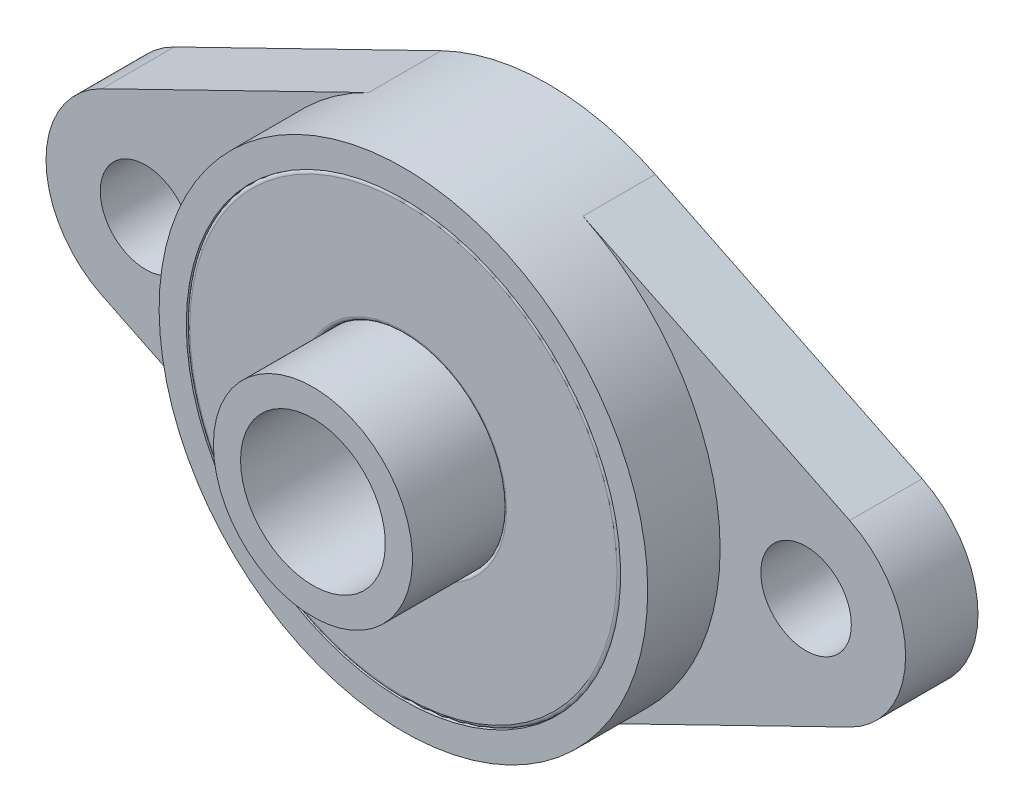
ISO-10303-21;
HEADER;
FILE_DESCRIPTION(('STEP AP214'),'2;1');
FILE_NAME('part.step','',(''),(''),'','','');
FILE_SCHEMA(('AUTOMOTIVE_DESIGN { 1 0 10303 214 1 1 1 1 }'));
ENDSEC;
DATA;
#1=APPLICATION_CONTEXT('core data for automotive mechanical design processes');
#2=APPLICATION_PROTOCOL_DEFINITION('international standard','automotive_design',2000,#1);
#3=PRODUCT_CONTEXT('',#1,'mechanical');
#4=PRODUCT('Part','Part','',(#3));
#5=PRODUCT_RELATED_PRODUCT_CATEGORY('part','',(#4));
#6=PRODUCT_DEFINITION_FORMATION('','',#4);
#7=PRODUCT_DEFINITION_CONTEXT('part definition',#1,'design');
#8=PRODUCT_DEFINITION('design','',#6,#7);
#9=PRODUCT_DEFINITION_SHAPE('','',#8);
#10=(LENGTH_UNIT() NAMED_UNIT(*) SI_UNIT(.MILLI.,.METRE.));
#11=(NAMED_UNIT(*) PLANE_ANGLE_UNIT() SI_UNIT($,.RADIAN.));
#12=(NAMED_UNIT(*) SI_UNIT($,.STERADIAN.) SOLID_ANGLE_UNIT());
#13=UNCERTAINTY_MEASURE_WITH_UNIT(LENGTH_MEASURE(1.E-05),#10,'distance_accuracy_value','');
#14=(GEOMETRIC_REPRESENTATION_CONTEXT(3) GLOBAL_UNCERTAINTY_ASSIGNED_CONTEXT((#13)) GLOBAL_UNIT_ASSIGNED_CONTEXT((#10,
#11,#12)) REPRESENTATION_CONTEXT('',''));
#15=CARTESIAN_POINT('',(0.,0.,0.));
#16=DIRECTION('',(0.,0.,1.));
#17=DIRECTION('',(1.,0.,0.));
#18=AXIS2_PLACEMENT_3D('',#15,#16,#17);
#19=CARTESIAN_POINT('',(0.,0.,8.));
#20=DIRECTION('',(0.,0.,-1.));
#21=DIRECTION('',(-1.,0.,0.));
#22=AXIS2_PLACEMENT_3D('',#19,#20,#21);
#23=CYLINDRICAL_SURFACE('',#22,5.5);
#24=CARTESIAN_POINT('',(0.,0.,0.2));
#25=DIRECTION('',(0.,0.,1.));
#26=DIRECTION('',(1.,0.,0.));
#27=AXIS2_PLACEMENT_3D('',#24,#25,#26);
#28=CIRCLE('',#27,5.5);
#29=CARTESIAN_POINT('',(5.5,0.,0.2));
#30=VERTEX_POINT('',#29);
#31=EDGE_CURVE('E63',#30,#30,#28,.F.);
#32=ORIENTED_EDGE('',*,*,#31,.T.);
#33=EDGE_LOOP('',(#32));
#34=FACE_BOUND('',#33,.T.);
#35=CARTESIAN_POINT('',(0.,0.,7.8));
#36=DIRECTION('',(0.,0.,1.));
#37=DIRECTION('',(1.,0.,0.));
#38=AXIS2_PLACEMENT_3D('',#35,#36,#37);
#39=CIRCLE('',#38,5.5);
#40=CARTESIAN_POINT('',(5.5,0.,7.8));
#41=VERTEX_POINT('',#40);
#42=EDGE_CURVE('E67',#41,#41,#39,.T.);
#43=ORIENTED_EDGE('',*,*,#42,.T.);
#44=EDGE_LOOP('',(#43));
#45=FACE_BOUND('',#44,.T.);
#46=ADVANCED_FACE('F52',(#34,#45),#23,.F.);
#47=CARTESIAN_POINT('',(0.,0.,8.));
#48=DIRECTION('',(0.,0.,-1.));
#49=DIRECTION('',(-1.,0.,0.));
#50=AXIS2_PLACEMENT_3D('',#47,#48,#49);
#51=CYLINDRICAL_SURFACE('',#50,12.);
#52=CARTESIAN_POINT('',(0.,0.,0.2));
#53=DIRECTION('',(0.,0.,1.));
#54=DIRECTION('',(1.,0.,0.));
#55=AXIS2_PLACEMENT_3D('',#52,#53,#54);
#56=CIRCLE('',#55,12.);
#57=CARTESIAN_POINT('',(12.,0.,0.2));
#58=VERTEX_POINT('',#57);
#59=EDGE_CURVE('E78',#58,#58,#56,.T.);
#60=ORIENTED_EDGE('',*,*,#59,.T.);
#61=EDGE_LOOP('',(#60));
#62=FACE_BOUND('',#61,.T.);
#63=CARTESIAN_POINT('',(0.,0.,7.8));
#64=DIRECTION('',(0.,0.,1.));
#65=DIRECTION('',(1.,0.,0.));
#66=AXIS2_PLACEMENT_3D('',#63,#64,#65);
#67=CIRCLE('',#66,12.);
#68=CARTESIAN_POINT('',(12.,0.,7.8));
#69=VERTEX_POINT('',#68);
#70=EDGE_CURVE('E81',#69,#69,#67,.F.);
#71=ORIENTED_EDGE('',*,*,#70,.T.);
#72=EDGE_LOOP('',(#71));
#73=FACE_BOUND('',#72,.T.);
#74=ADVANCED_FACE('F85',(#62,#73),#51,.T.);
#75=CARTESIAN_POINT('',(0.,0.,8.));
#76=DIRECTION('',(0.,0.,1.));
#77=DIRECTION('',(1.,0.,0.));
#78=AXIS2_PLACEMENT_3D('',#75,#76,#77);
#79=PLANE('',#78);
#80=CARTESIAN_POINT('',(0.,0.,8.));
#81=DIRECTION('',(0.,0.,1.));
#82=DIRECTION('',(1.,0.,0.));
#83=AXIS2_PLACEMENT_3D('',#80,#81,#82);
#84=CIRCLE('',#83,5.7);
#85=CARTESIAN_POINT('',(5.7,0.,8.));
#86=VERTEX_POINT('',#85);
#87=EDGE_CURVE('E12',#86,#86,#84,.F.);
#88=ORIENTED_EDGE('',*,*,#87,.T.);
#89=EDGE_LOOP('',(#88));
#90=FACE_BOUND('',#89,.T.);
#91=CARTESIAN_POINT('',(0.,0.,8.));
#92=DIRECTION('',(0.,0.,1.));
#93=DIRECTION('',(1.,0.,0.));
#94=AXIS2_PLACEMENT_3D('',#91,#92,#93);
#95=CIRCLE('',#94,11.8);
#96=CARTESIAN_POINT('',(11.8,0.,8.));
#97=VERTEX_POINT('',#96);
#98=EDGE_CURVE('E59',#97,#97,#95,.T.);
#99=ORIENTED_EDGE('',*,*,#98,.T.);
#100=EDGE_LOOP('',(#99));
#101=FACE_BOUND('',#100,.T.);
#102=ADVANCED_FACE('F101',(#90,#101),#79,.T.);
#103=CARTESIAN_POINT('',(0.,0.,0.));
#104=DIRECTION('',(0.,0.,1.));
#105=DIRECTION('',(1.,0.,0.));
#106=AXIS2_PLACEMENT_3D('',#103,#104,#105);
#107=PLANE('',#106);
#108=CARTESIAN_POINT('',(0.,0.,0.));
#109=DIRECTION('',(0.,0.,1.));
#110=DIRECTION('',(1.,0.,0.));
#111=AXIS2_PLACEMENT_3D('',#108,#109,#110);
#112=CIRCLE('',#111,11.8);
#113=CARTESIAN_POINT('',(11.8,0.,0.));
#114=VERTEX_POINT('',#113);
#115=EDGE_CURVE('E72',#114,#114,#112,.F.);
#116=ORIENTED_EDGE('',*,*,#115,.T.);
#117=EDGE_LOOP('',(#116));
#118=FACE_BOUND('',#117,.T.);
#119=CARTESIAN_POINT('',(0.,0.,0.));
#120=DIRECTION('',(0.,0.,1.));
#121=DIRECTION('',(1.,0.,0.));
#122=AXIS2_PLACEMENT_3D('',#119,#120,#121);
#123=CIRCLE('',#122,5.7);
#124=CARTESIAN_POINT('',(5.7,0.,0.));
#125=VERTEX_POINT('',#124);
#126=EDGE_CURVE('E75',#125,#125,#123,.T.);
#127=ORIENTED_EDGE('',*,*,#126,.T.);
#128=EDGE_LOOP('',(#127));
#129=FACE_BOUND('',#128,.T.);
#130=ADVANCED_FACE('F110',(#118,#129),#107,.F.);
#131=CARTESIAN_POINT('',(0.,0.,0.2));
#132=DIRECTION('',(0.,0.,1.));
#133=DIRECTION('',(1.,0.,0.));
#134=AXIS2_PLACEMENT_3D('',#131,#132,#133);
#135=TOROIDAL_SURFACE('',#134,11.8,0.2);
#136=ORIENTED_EDGE('',*,*,#115,.F.);
#137=EDGE_LOOP('',(#136));
#138=FACE_BOUND('',#137,.T.);
#139=ORIENTED_EDGE('',*,*,#59,.F.);
#140=EDGE_LOOP('',(#139));
#141=FACE_BOUND('',#140,.T.);
#142=ADVANCED_FACE('F107',(#138,#141),#135,.T.);
#143=CARTESIAN_POINT('',(0.,0.,0.2));
#144=DIRECTION('',(0.,0.,1.));
#145=DIRECTION('',(1.,0.,0.));
#146=AXIS2_PLACEMENT_3D('',#143,#144,#145);
#147=TOROIDAL_SURFACE('',#146,5.7,0.2);
#148=ORIENTED_EDGE('',*,*,#31,.F.);
#149=EDGE_LOOP('',(#148));
#150=FACE_BOUND('',#149,.T.);
#151=ORIENTED_EDGE('',*,*,#126,.F.);
#152=EDGE_LOOP('',(#151));
#153=FACE_BOUND('',#152,.T.);
#154=ADVANCED_FACE('F93',(#150,#153),#147,.T.);
#155=CARTESIAN_POINT('',(0.,0.,7.8));
#156=DIRECTION('',(0.,0.,1.));
#157=DIRECTION('',(1.,0.,0.));
#158=AXIS2_PLACEMENT_3D('',#155,#156,#157);
#159=TOROIDAL_SURFACE('',#158,5.7,0.2);
#160=ORIENTED_EDGE('',*,*,#87,.F.);
#161=EDGE_LOOP('',(#160));
#162=FACE_BOUND('',#161,.T.);
#163=ORIENTED_EDGE('',*,*,#42,.F.);
#164=EDGE_LOOP('',(#163));
#165=FACE_BOUND('',#164,.T.);
#166=ADVANCED_FACE('F89',(#162,#165),#159,.T.);
#167=CARTESIAN_POINT('',(0.,0.,7.8));
#168=DIRECTION('',(0.,0.,1.));
#169=DIRECTION('',(1.,0.,0.));
#170=AXIS2_PLACEMENT_3D('',#167,#168,#169);
#171=TOROIDAL_SURFACE('',#170,11.8,0.2);
#172=ORIENTED_EDGE('',*,*,#70,.F.);
#173=EDGE_LOOP('',(#172));
#174=FACE_BOUND('',#173,.T.);
#175=ORIENTED_EDGE('',*,*,#98,.F.);
#176=EDGE_LOOP('',(#175));
#177=FACE_BOUND('',#176,.T.);
#178=ADVANCED_FACE('F54',(#174,#177),#171,.T.);
#179=CLOSED_SHELL('',(#46,#74,#102,#130,#142,#154,#166,#178));
#180=MANIFOLD_SOLID_BREP('B2',#179);
#181=CARTESIAN_POINT('',(0.,0.,13.));
#182=DIRECTION('',(0.,0.,-1.));
#183=DIRECTION('',(-1.,0.,0.));
#184=AXIS2_PLACEMENT_3D('',#181,#182,#183);
#185=CYLINDRICAL_SURFACE('',#184,4.);
#186=CARTESIAN_POINT('',(0.,0.,13.));
#187=DIRECTION('',(0.,0.,1.));
#188=DIRECTION('',(1.,0.,0.));
#189=AXIS2_PLACEMENT_3D('',#186,#187,#188);
#190=CIRCLE('',#189,4.);
#191=CARTESIAN_POINT('',(-4.,0.,13.));
#192=VERTEX_POINT('',#191);
#193=EDGE_CURVE('E191',#192,#192,#190,.T.);
#194=CARTESIAN_POINT('',(0.,0.,0.));
#195=DIRECTION('',(0.,0.,1.));
#196=DIRECTION('',(1.,0.,0.));
#197=AXIS2_PLACEMENT_3D('',#194,#195,#196);
#198=CIRCLE('',#197,4.);
#199=CARTESIAN_POINT('',(-4.,0.,0.));
#200=VERTEX_POINT('',#199);
#201=EDGE_CURVE('E197',#200,#200,#198,.T.);
#202=CARTESIAN_POINT('',(-4.,0.,13.));
#203=CARTESIAN_POINT('',(-4.,0.,12.8645833333333));
#204=CARTESIAN_POINT('',(-4.,0.,12.7291666666667));
#205=CARTESIAN_POINT('',(-4.,0.,12.4583333333333));
#206=CARTESIAN_POINT('',(-4.,0.,12.3229166666667));
#207=CARTESIAN_POINT('',(-4.,0.,12.0520833333333));
#208=CARTESIAN_POINT('',(-4.,0.,11.9166666666667));
#209=CARTESIAN_POINT('',(-4.,0.,11.6458333333333));
#210=CARTESIAN_POINT('',(-4.,0.,11.5104166666667));
#211=CARTESIAN_POINT('',(-4.,0.,11.2395833333333));
#212=CARTESIAN_POINT('',(-4.,0.,11.1041666666667));
#213=CARTESIAN_POINT('',(-4.,0.,10.8333333333333));
#214=CARTESIAN_POINT('',(-4.,0.,10.6979166666667));
#215=CARTESIAN_POINT('',(-4.,0.,10.4270833333333));
#216=CARTESIAN_POINT('',(-4.,0.,10.2916666666667));
#217=CARTESIAN_POINT('',(-4.,0.,10.0208333333333));
#218=CARTESIAN_POINT('',(-4.,0.,9.88541666666667));
#219=CARTESIAN_POINT('',(-4.,0.,9.61458333333333));
#220=CARTESIAN_POINT('',(-4.,0.,9.47916666666667));
#221=CARTESIAN_POINT('',(-4.,0.,9.20833333333333));
#222=CARTESIAN_POINT('',(-4.,0.,9.07291666666667));
#223=CARTESIAN_POINT('',(-4.,0.,8.80208333333333));
#224=CARTESIAN_POINT('',(-4.,0.,8.66666666666667));
#225=CARTESIAN_POINT('',(-4.,0.,8.39583333333333));
#226=CARTESIAN_POINT('',(-4.,0.,8.26041666666667));
#227=CARTESIAN_POINT('',(-4.,0.,7.98958333333333));
#228=CARTESIAN_POINT('',(-4.,0.,7.85416666666667));
#229=CARTESIAN_POINT('',(-4.,0.,7.58333333333333));
#230=CARTESIAN_POINT('',(-4.,0.,7.44791666666667));
#231=CARTESIAN_POINT('',(-4.,0.,7.17708333333333));
#232=CARTESIAN_POINT('',(-4.,0.,7.04166666666667));
#233=CARTESIAN_POINT('',(-4.,0.,6.77083333333333));
#234=CARTESIAN_POINT('',(-4.,0.,6.63541666666667));
#235=CARTESIAN_POINT('',(-4.,0.,6.36458333333333));
#236=CARTESIAN_POINT('',(-4.,0.,6.22916666666667));
#237=CARTESIAN_POINT('',(-4.,0.,5.95833333333333));
#238=CARTESIAN_POINT('',(-4.,0.,5.82291666666667));
#239=CARTESIAN_POINT('',(-4.,0.,5.55208333333333));
#240=CARTESIAN_POINT('',(-4.,0.,5.41666666666667));
#241=CARTESIAN_POINT('',(-4.,0.,5.14583333333333));
#242=CARTESIAN_POINT('',(-4.,0.,5.01041666666667));
#243=CARTESIAN_POINT('',(-4.,0.,4.73958333333333));
#244=CARTESIAN_POINT('',(-4.,0.,4.60416666666667));
#245=CARTESIAN_POINT('',(-4.,0.,4.33333333333333));
#246=CARTESIAN_POINT('',(-4.,0.,4.19791666666667));
#247=CARTESIAN_POINT('',(-4.,0.,3.92708333333333));
#248=CARTESIAN_POINT('',(-4.,0.,3.79166666666667));
#249=CARTESIAN_POINT('',(-4.,0.,3.52083333333333));
#250=CARTESIAN_POINT('',(-4.,0.,3.38541666666667));
#251=CARTESIAN_POINT('',(-4.,0.,3.11458333333333));
#252=CARTESIAN_POINT('',(-4.,0.,2.97916666666667));
#253=CARTESIAN_POINT('',(-4.,0.,2.70833333333333));
#254=CARTESIAN_POINT('',(-4.,0.,2.57291666666667));
#255=CARTESIAN_POINT('',(-4.,0.,2.30208333333333));
#256=CARTESIAN_POINT('',(-4.,0.,2.16666666666667));
#257=CARTESIAN_POINT('',(-4.,0.,1.89583333333333));
#258=CARTESIAN_POINT('',(-4.,0.,1.76041666666667));
#259=CARTESIAN_POINT('',(-4.,0.,1.48958333333333));
#260=CARTESIAN_POINT('',(-4.,0.,1.35416666666667));
#261=CARTESIAN_POINT('',(-4.,0.,1.08333333333333));
#262=CARTESIAN_POINT('',(-4.,0.,0.947916666666667));
#263=CARTESIAN_POINT('',(-4.,0.,0.677083333333334));
#264=CARTESIAN_POINT('',(-4.,0.,0.541666666666667));
#265=CARTESIAN_POINT('',(-4.,0.,0.270833333333334));
#266=CARTESIAN_POINT('',(-4.,0.,0.135416666666667));
#267=CARTESIAN_POINT('',(-4.,0.,0.));
#268=B_SPLINE_CURVE_WITH_KNOTS('',3,(#202,#203,#204,#205,#206,#207,#208,#209,#210,#211,#212,
#213,#214,#215,#216,#217,#218,#219,#220,#221,#222,#223,#224,#225,#226,#227,#228,#229,#230,#231,
#232,#233,#234,#235,#236,#237,#238,#239,#240,#241,#242,#243,#244,#245,#246,#247,#248,#249,#250,
#251,#252,#253,#254,#255,#256,#257,#258,#259,#260,#261,#262,#263,#264,#265,#266,#267),
.UNSPECIFIED.,.F.,.F.,(4,2,2,2,2,2,2,2,2,2,2,2,2,2,2,2,2,2,2,2,2,2,2,2,2,2,2,2,2,2,2,2,4),(0.,
0.406249999999999,0.812499999999999,1.21875,1.625,2.03125,2.4375,2.84375,3.25,3.65625,4.0625,
4.46875,4.875,5.28125,5.6875,6.09375,6.5,6.90625,7.3125,7.71875,8.125,8.53125,8.9375,9.34375,
9.75,10.15625,10.5625,10.96875,11.375,11.78125,12.1875,12.59375,13.),.UNSPECIFIED.);
#269=EDGE_CURVE('BSEAM184',#192,#200,#268,.T.);
#270=ORIENTED_EDGE('',*,*,#193,.T.);
#271=ORIENTED_EDGE('',*,*,#201,.F.);
#272=ORIENTED_EDGE('',*,*,#269,.T.);
#273=ORIENTED_EDGE('',*,*,#269,.F.);
#274=EDGE_LOOP('',(#270,#272,#271,#273));
#275=FACE_BOUND('',#274,.T.);
#276=ADVANCED_FACE('F184',(#275),#185,.F.);
#277=CARTESIAN_POINT('',(0.,0.,13.));
#278=DIRECTION('',(0.,0.,-1.));
#279=DIRECTION('',(-1.,0.,0.));
#280=AXIS2_PLACEMENT_3D('',#277,#278,#279);
#281=CYLINDRICAL_SURFACE('',#280,5.5);
#282=CARTESIAN_POINT('',(0.,0.,13.));
#283=DIRECTION('',(0.,0.,1.));
#284=DIRECTION('',(1.,0.,0.));
#285=AXIS2_PLACEMENT_3D('',#282,#283,#284);
#286=CIRCLE('',#285,5.5);
#287=CARTESIAN_POINT('',(-5.5,0.,13.));
#288=VERTEX_POINT('',#287);
#289=EDGE_CURVE('E51',#288,#288,#286,.T.);
#290=CARTESIAN_POINT('',(0.,0.,0.));
#291=DIRECTION('',(0.,0.,1.));
#292=DIRECTION('',(1.,0.,0.));
#293=AXIS2_PLACEMENT_3D('',#290,#291,#292);
#294=CIRCLE('',#293,5.5);
#295=CARTESIAN_POINT('',(-5.5,0.,0.));
#296=VERTEX_POINT('',#295);
#297=EDGE_CURVE('E187',#296,#296,#294,.T.);
#298=CARTESIAN_POINT('',(-5.5,0.,13.));
#299=CARTESIAN_POINT('',(-5.5,0.,12.8645833333333));
#300=CARTESIAN_POINT('',(-5.5,0.,12.7291666666667));
#301=CARTESIAN_POINT('',(-5.5,0.,12.4583333333333));
#302=CARTESIAN_POINT('',(-5.5,0.,12.3229166666667));
#303=CARTESIAN_POINT('',(-5.5,0.,12.0520833333333));
#304=CARTESIAN_POINT('',(-5.5,0.,11.9166666666667));
#305=CARTESIAN_POINT('',(-5.5,0.,11.6458333333333));
#306=CARTESIAN_POINT('',(-5.5,0.,11.5104166666667));
#307=CARTESIAN_POINT('',(-5.5,0.,11.2395833333333));
#308=CARTESIAN_POINT('',(-5.5,0.,11.1041666666667));
#309=CARTESIAN_POINT('',(-5.5,0.,10.8333333333333));
#310=CARTESIAN_POINT('',(-5.5,0.,10.6979166666667));
#311=CARTESIAN_POINT('',(-5.5,0.,10.4270833333333));
#312=CARTESIAN_POINT('',(-5.5,0.,10.2916666666667));
#313=CARTESIAN_POINT('',(-5.5,0.,10.0208333333333));
#314=CARTESIAN_POINT('',(-5.5,0.,9.88541666666667));
#315=CARTESIAN_POINT('',(-5.5,0.,9.61458333333333));
#316=CARTESIAN_POINT('',(-5.5,0.,9.47916666666667));
#317=CARTESIAN_POINT('',(-5.5,0.,9.20833333333333));
#318=CARTESIAN_POINT('',(-5.5,0.,9.07291666666666));
#319=CARTESIAN_POINT('',(-5.5,0.,8.80208333333333));
#320=CARTESIAN_POINT('',(-5.5,0.,8.66666666666667));
#321=CARTESIAN_POINT('',(-5.5,0.,8.39583333333333));
#322=CARTESIAN_POINT('',(-5.5,0.,8.26041666666667));
#323=CARTESIAN_POINT('',(-5.5,0.,7.98958333333333));
#324=CARTESIAN_POINT('',(-5.5,0.,7.85416666666667));
#325=CARTESIAN_POINT('',(-5.5,0.,7.58333333333333));
#326=CARTESIAN_POINT('',(-5.5,0.,7.44791666666667));
#327=CARTESIAN_POINT('',(-5.5,0.,7.17708333333333));
#328=CARTESIAN_POINT('',(-5.5,0.,7.04166666666667));
#329=CARTESIAN_POINT('',(-5.5,0.,6.77083333333333));
#330=CARTESIAN_POINT('',(-5.5,0.,6.63541666666667));
#331=CARTESIAN_POINT('',(-5.5,0.,6.36458333333333));
#332=CARTESIAN_POINT('',(-5.5,0.,6.22916666666667));
#333=CARTESIAN_POINT('',(-5.5,0.,5.95833333333333));
#334=CARTESIAN_POINT('',(-5.5,0.,5.82291666666667));
#335=CARTESIAN_POINT('',(-5.5,0.,5.55208333333333));
#336=CARTESIAN_POINT('',(-5.5,0.,5.41666666666667));
#337=CARTESIAN_POINT('',(-5.5,0.,5.14583333333333));
#338=CARTESIAN_POINT('',(-5.5,0.,5.01041666666667));
#339=CARTESIAN_POINT('',(-5.5,0.,4.73958333333333));
#340=CARTESIAN_POINT('',(-5.5,0.,4.60416666666667));
#341=CARTESIAN_POINT('',(-5.5,0.,4.33333333333333));
#342=CARTESIAN_POINT('',(-5.5,0.,4.19791666666667));
#343=CARTESIAN_POINT('',(-5.5,0.,3.92708333333333));
#344=CARTESIAN_POINT('',(-5.5,0.,3.79166666666667));
#345=CARTESIAN_POINT('',(-5.5,0.,3.52083333333333));
#346=CARTESIAN_POINT('',(-5.5,0.,3.38541666666667));
#347=CARTESIAN_POINT('',(-5.5,0.,3.11458333333333));
#348=CARTESIAN_POINT('',(-5.5,0.,2.97916666666667));
#349=CARTESIAN_POINT('',(-5.5,0.,2.70833333333333));
#350=CARTESIAN_POINT('',(-5.5,0.,2.57291666666667));
#351=CARTESIAN_POINT('',(-5.5,0.,2.30208333333333));
#352=CARTESIAN_POINT('',(-5.5,0.,2.16666666666667));
#353=CARTESIAN_POINT('',(-5.5,0.,1.89583333333333));
#354=CARTESIAN_POINT('',(-5.5,0.,1.76041666666667));
#355=CARTESIAN_POINT('',(-5.5,0.,1.48958333333333));
#356=CARTESIAN_POINT('',(-5.5,0.,1.35416666666667));
#357=CARTESIAN_POINT('',(-5.5,0.,1.08333333333333));
#358=CARTESIAN_POINT('',(-5.5,0.,0.947916666666667));
#359=CARTESIAN_POINT('',(-5.5,0.,0.677083333333334));
#360=CARTESIAN_POINT('',(-5.5,0.,0.541666666666667));
#361=CARTESIAN_POINT('',(-5.5,0.,0.270833333333334));
#362=CARTESIAN_POINT('',(-5.5,0.,0.135416666666667));
#363=CARTESIAN_POINT('',(-5.5,0.,0.));
#364=B_SPLINE_CURVE_WITH_KNOTS('',3,(#298,#299,#300,#301,#302,#303,#304,#305,#306,#307,#308,
#309,#310,#311,#312,#313,#314,#315,#316,#317,#318,#319,#320,#321,#322,#323,#324,#325,#326,#327,
#328,#329,#330,#331,#332,#333,#334,#335,#336,#337,#338,#339,#340,#341,#342,#343,#344,#345,#346,
#347,#348,#349,#350,#351,#352,#353,#354,#355,#356,#357,#358,#359,#360,#361,#362,#363),
.UNSPECIFIED.,.F.,.F.,(4,2,2,2,2,2,2,2,2,2,2,2,2,2,2,2,2,2,2,2,2,2,2,2,2,2,2,2,2,2,2,2,4),(0.,
0.40625,0.812500000000001,1.21875,1.625,2.03125,2.4375,2.84375,3.25,3.65625,4.0625,4.46875,
4.875,5.28125,5.6875,6.09375,6.5,6.90625,7.3125,7.71875,8.125,8.53125,8.9375,9.34375,9.75,
10.15625,10.5625,10.96875,11.375,11.78125,12.1875,12.59375,13.),.UNSPECIFIED.);
#365=EDGE_CURVE('BSEAM204',#288,#296,#364,.T.);
#366=ORIENTED_EDGE('',*,*,#289,.F.);
#367=ORIENTED_EDGE('',*,*,#297,.T.);
#368=ORIENTED_EDGE('',*,*,#365,.T.);
#369=ORIENTED_EDGE('',*,*,#365,.F.);
#370=EDGE_LOOP('',(#366,#368,#367,#369));
#371=FACE_BOUND('',#370,.T.);
#372=ADVANCED_FACE('F204',(#371),#281,.T.);
#373=CARTESIAN_POINT('',(0.,0.,13.));
#374=DIRECTION('',(0.,0.,1.));
#375=DIRECTION('',(1.,0.,0.));
#376=AXIS2_PLACEMENT_3D('',#373,#374,#375);
#377=PLANE('',#376);
#378=ORIENTED_EDGE('',*,*,#193,.F.);
#379=EDGE_LOOP('',(#378));
#380=FACE_BOUND('',#379,.T.);
#381=ORIENTED_EDGE('',*,*,#289,.T.);
#382=EDGE_LOOP('',(#381));
#383=FACE_BOUND('',#382,.T.);
#384=ADVANCED_FACE('F208',(#380,#383),#377,.T.);
#385=CARTESIAN_POINT('',(0.,0.,0.));
#386=DIRECTION('',(0.,0.,1.));
#387=DIRECTION('',(1.,0.,0.));
#388=AXIS2_PLACEMENT_3D('',#385,#386,#387);
#389=PLANE('',#388);
#390=ORIENTED_EDGE('',*,*,#201,.T.);
#391=EDGE_LOOP('',(#390));
#392=FACE_BOUND('',#391,.T.);
#393=ORIENTED_EDGE('',*,*,#297,.F.);
#394=EDGE_LOOP('',(#393));
#395=FACE_BOUND('',#394,.T.);
#396=ADVANCED_FACE('F206',(#392,#395),#389,.F.);
#397=CLOSED_SHELL('',(#276,#372,#384,#396));
#398=MANIFOLD_SOLID_BREP('B7',#397);
#399=CARTESIAN_POINT('',(0.,0.,13.));
#400=DIRECTION('',(0.,0.,-1.));
#401=DIRECTION('',(-1.,0.,0.));
#402=AXIS2_PLACEMENT_3D('',#399,#400,#401);
#403=CYLINDRICAL_SURFACE('',#402,13.5);
#404=DIRECTION('',(0.,0.,-1.));
#405=VECTOR('',#404,1.);
#406=CARTESIAN_POINT('',(5.91780821917808,-12.1338182729522,4.));
#407=LINE('',#406,#405);
#408=CARTESIAN_POINT('',(5.91780821917808,-12.1338182729522,4.));
#409=VERTEX_POINT('',#408);
#410=CARTESIAN_POINT('',(5.91780821917808,-12.1338182729522,0.));
#411=VERTEX_POINT('',#410);
#412=EDGE_CURVE('E262',#409,#411,#407,.T.);
#413=ORIENTED_EDGE('',*,*,#412,.F.);
#414=CARTESIAN_POINT('',(0.,0.,4.));
#415=DIRECTION('',(0.,0.,-1.));
#416=DIRECTION('',(-1.,0.,0.));
#417=AXIS2_PLACEMENT_3D('',#414,#415,#416);
#418=CIRCLE('',#417,13.5);
#419=CARTESIAN_POINT('',(5.91780821917808,12.1338182729522,4.));
#420=VERTEX_POINT('',#419);
#421=EDGE_CURVE('E267',#420,#409,#418,.T.);
#422=ORIENTED_EDGE('',*,*,#421,.F.);
#423=DIRECTION('',(0.,0.,-1.));
#424=VECTOR('',#423,1.);
#425=CARTESIAN_POINT('',(5.91780821917808,12.1338182729522,4.));
#426=LINE('',#425,#424);
#427=CARTESIAN_POINT('',(5.91780821917808,12.1338182729522,0.));
#428=VERTEX_POINT('',#427);
#429=EDGE_CURVE('E332',#420,#428,#426,.T.);
#430=ORIENTED_EDGE('',*,*,#429,.T.);
#431=CARTESIAN_POINT('',(0.,0.,0.));
#432=DIRECTION('',(0.,0.,1.));
#433=DIRECTION('',(1.,0.,0.));
#434=AXIS2_PLACEMENT_3D('',#431,#432,#433);
#435=CIRCLE('',#434,13.5);
#436=CARTESIAN_POINT('',(-5.91780821917808,12.1338182729522,0.));
#437=VERTEX_POINT('',#436);
#438=EDGE_CURVE('E256',#428,#437,#435,.T.);
#439=ORIENTED_EDGE('',*,*,#438,.T.);
#440=DIRECTION('',(0.,0.,-1.));
#441=VECTOR('',#440,1.);
#442=CARTESIAN_POINT('',(-5.91780821917808,12.1338182729522,4.));
#443=LINE('',#442,#441);
#444=CARTESIAN_POINT('',(-5.91780821917808,12.1338182729522,4.));
#445=VERTEX_POINT('',#444);
#446=EDGE_CURVE('E376',#445,#437,#443,.T.);
#447=ORIENTED_EDGE('',*,*,#446,.F.);
#448=CARTESIAN_POINT('',(0.,0.,4.));
#449=DIRECTION('',(0.,0.,1.));
#450=DIRECTION('',(1.,0.,0.));
#451=AXIS2_PLACEMENT_3D('',#448,#449,#450);
#452=CIRCLE('',#451,13.5);
#453=CARTESIAN_POINT('',(-5.91780821917808,-12.1338182729522,4.));
#454=VERTEX_POINT('',#453);
#455=EDGE_CURVE('E356',#445,#454,#452,.T.);
#456=ORIENTED_EDGE('',*,*,#455,.T.);
#457=DIRECTION('',(0.,0.,-1.));
#458=VECTOR('',#457,1.);
#459=CARTESIAN_POINT('',(-5.91780821917808,-12.1338182729522,4.));
#460=LINE('',#459,#458);
#461=CARTESIAN_POINT('',(-5.91780821917808,-12.1338182729522,0.));
#462=VERTEX_POINT('',#461);
#463=EDGE_CURVE('E368',#454,#462,#460,.T.);
#464=ORIENTED_EDGE('',*,*,#463,.T.);
#465=EDGE_CURVE('E182',#462,#411,#435,.T.);
#466=ORIENTED_EDGE('',*,*,#465,.T.);
#467=EDGE_LOOP('',(#413,#422,#430,#439,#447,#456,#464,#466));
#468=FACE_BOUND('',#467,.T.);
#469=CARTESIAN_POINT('',(0.,0.,8.));
#470=DIRECTION('',(0.,0.,1.));
#471=DIRECTION('',(1.,0.,0.));
#472=AXIS2_PLACEMENT_3D('',#469,#470,#471);
#473=CIRCLE('',#472,13.5);
#474=CARTESIAN_POINT('',(13.5,0.,8.));
#475=VERTEX_POINT('',#474);
#476=EDGE_CURVE('E460',#475,#475,#473,.T.);
#477=ORIENTED_EDGE('',*,*,#476,.F.);
#478=EDGE_LOOP('',(#477));
#479=FACE_BOUND('',#478,.T.);
#480=ADVANCED_FACE('F247',(#468,#479),#403,.T.);
#481=CARTESIAN_POINT('',(0.,0.,13.));
#482=DIRECTION('',(0.,0.,-1.));
#483=DIRECTION('',(-1.,0.,0.));
#484=AXIS2_PLACEMENT_3D('',#481,#482,#483);
#485=CYLINDRICAL_SURFACE('',#484,12.);
#486=CARTESIAN_POINT('',(0.,0.,0.));
#487=DIRECTION('',(0.,0.,1.));
#488=DIRECTION('',(1.,0.,0.));
#489=AXIS2_PLACEMENT_3D('',#486,#487,#488);
#490=CIRCLE('',#489,12.);
#491=CARTESIAN_POINT('',(-12.,0.,0.));
#492=VERTEX_POINT('',#491);
#493=EDGE_CURVE('E379',#492,#492,#490,.T.);
#494=CARTESIAN_POINT('',(0.,0.,8.));
#495=DIRECTION('',(0.,0.,1.));
#496=DIRECTION('',(1.,0.,0.));
#497=AXIS2_PLACEMENT_3D('',#494,#495,#496);
#498=CIRCLE('',#497,12.);
#499=CARTESIAN_POINT('',(-12.,0.,8.));
#500=VERTEX_POINT('',#499);
#501=EDGE_CURVE('E251',#500,#500,#498,.T.);
#502=CARTESIAN_POINT('',(-12.,0.,0.));
#503=CARTESIAN_POINT('',(-12.,0.,0.0833333333333333));
#504=CARTESIAN_POINT('',(-12.,0.,0.166666666666667));
#505=CARTESIAN_POINT('',(-12.,0.,0.333333333333334));
#506=CARTESIAN_POINT('',(-12.,0.,0.416666666666667));
#507=CARTESIAN_POINT('',(-12.,0.,0.583333333333334));
#508=CARTESIAN_POINT('',(-12.,0.,0.666666666666667));
#509=CARTESIAN_POINT('',(-12.,0.,0.833333333333334));
#510=CARTESIAN_POINT('',(-12.,0.,0.916666666666668));
#511=CARTESIAN_POINT('',(-12.,0.,1.08333333333333));
#512=CARTESIAN_POINT('',(-12.,0.,1.16666666666667));
#513=CARTESIAN_POINT('',(-12.,0.,1.33333333333333));
#514=CARTESIAN_POINT('',(-12.,0.,1.41666666666667));
#515=CARTESIAN_POINT('',(-12.,0.,1.58333333333333));
#516=CARTESIAN_POINT('',(-12.,0.,1.66666666666667));
#517=CARTESIAN_POINT('',(-12.,0.,1.83333333333333));
#518=CARTESIAN_POINT('',(-12.,0.,1.91666666666667));
#519=CARTESIAN_POINT('',(-12.,0.,2.08333333333333));
#520=CARTESIAN_POINT('',(-12.,0.,2.16666666666667));
#521=CARTESIAN_POINT('',(-12.,0.,2.33333333333333));
#522=CARTESIAN_POINT('',(-12.,0.,2.41666666666667));
#523=CARTESIAN_POINT('',(-12.,0.,2.58333333333333));
#524=CARTESIAN_POINT('',(-12.,0.,2.66666666666667));
#525=CARTESIAN_POINT('',(-12.,0.,2.83333333333333));
#526=CARTESIAN_POINT('',(-12.,0.,2.91666666666667));
#527=CARTESIAN_POINT('',(-12.,0.,3.08333333333333));
#528=CARTESIAN_POINT('',(-12.,0.,3.16666666666667));
#529=CARTESIAN_POINT('',(-12.,0.,3.33333333333333));
#530=CARTESIAN_POINT('',(-12.,0.,3.41666666666667));
#531=CARTESIAN_POINT('',(-12.,0.,3.58333333333333));
#532=CARTESIAN_POINT('',(-12.,0.,3.66666666666667));
#533=CARTESIAN_POINT('',(-12.,0.,3.83333333333333));
#534=CARTESIAN_POINT('',(-12.,0.,3.91666666666667));
#535=CARTESIAN_POINT('',(-12.,0.,4.08333333333333));
#536=CARTESIAN_POINT('',(-12.,0.,4.16666666666667));
#537=CARTESIAN_POINT('',(-12.,0.,4.33333333333333));
#538=CARTESIAN_POINT('',(-12.,0.,4.41666666666667));
#539=CARTESIAN_POINT('',(-12.,0.,4.58333333333333));
#540=CARTESIAN_POINT('',(-12.,0.,4.66666666666667));
#541=CARTESIAN_POINT('',(-12.,0.,4.83333333333333));
#542=CARTESIAN_POINT('',(-12.,0.,4.91666666666667));
#543=CARTESIAN_POINT('',(-12.,0.,5.08333333333333));
#544=CARTESIAN_POINT('',(-12.,0.,5.16666666666667));
#545=CARTESIAN_POINT('',(-12.,0.,5.33333333333333));
#546=CARTESIAN_POINT('',(-12.,0.,5.41666666666667));
#547=CARTESIAN_POINT('',(-12.,0.,5.58333333333333));
#548=CARTESIAN_POINT('',(-12.,0.,5.66666666666667));
#549=CARTESIAN_POINT('',(-12.,0.,5.83333333333333));
#550=CARTESIAN_POINT('',(-12.,0.,5.91666666666667));
#551=CARTESIAN_POINT('',(-12.,0.,6.08333333333333));
#552=CARTESIAN_POINT('',(-12.,0.,6.16666666666667));
#553=CARTESIAN_POINT('',(-12.,0.,6.33333333333333));
#554=CARTESIAN_POINT('',(-12.,0.,6.41666666666667));
#555=CARTESIAN_POINT('',(-12.,0.,6.58333333333333));
#556=CARTESIAN_POINT('',(-12.,0.,6.66666666666667));
#557=CARTESIAN_POINT('',(-12.,0.,6.83333333333333));
#558=CARTESIAN_POINT('',(-12.,0.,6.91666666666667));
#559=CARTESIAN_POINT('',(-12.,0.,7.08333333333333));
#560=CARTESIAN_POINT('',(-12.,0.,7.16666666666667));
#561=CARTESIAN_POINT('',(-12.,0.,7.33333333333333));
#562=CARTESIAN_POINT('',(-12.,0.,7.41666666666667));
#563=CARTESIAN_POINT('',(-12.,0.,7.58333333333333));
#564=CARTESIAN_POINT('',(-12.,0.,7.66666666666667));
#565=CARTESIAN_POINT('',(-12.,0.,7.83333333333333));
#566=CARTESIAN_POINT('',(-12.,0.,7.91666666666667));
#567=CARTESIAN_POINT('',(-12.,0.,8.));
#568=B_SPLINE_CURVE_WITH_KNOTS('',3,(#502,#503,#504,#505,#506,#507,#508,#509,#510,#511,#512,
#513,#514,#515,#516,#517,#518,#519,#520,#521,#522,#523,#524,#525,#526,#527,#528,#529,#530,#531,
#532,#533,#534,#535,#536,#537,#538,#539,#540,#541,#542,#543,#544,#545,#546,#547,#548,#549,#550,
#551,#552,#553,#554,#555,#556,#557,#558,#559,#560,#561,#562,#563,#564,#565,#566,#567),
.UNSPECIFIED.,.F.,.F.,(4,2,2,2,2,2,2,2,2,2,2,2,2,2,2,2,2,2,2,2,2,2,2,2,2,2,2,2,2,2,2,2,4),(0.,
0.25,0.5,0.750000000000001,1.,1.25,1.5,1.75,2.,2.25,2.5,2.75,3.,3.25,3.5,3.75,4.,4.25,4.5,4.75,
5.,5.25,5.5,5.75,6.,6.25,6.5,6.75,7.,7.25,7.5,7.75,8.),.UNSPECIFIED.);
#569=EDGE_CURVE('BSEAM249',#492,#500,#568,.T.);
#570=ORIENTED_EDGE('',*,*,#493,.F.);
#571=ORIENTED_EDGE('',*,*,#501,.T.);
#572=ORIENTED_EDGE('',*,*,#569,.T.);
#573=ORIENTED_EDGE('',*,*,#569,.F.);
#574=EDGE_LOOP('',(#570,#572,#571,#573));
#575=FACE_BOUND('',#574,.T.);
#576=ADVANCED_FACE('F249',(#575),#485,.F.);
#577=CARTESIAN_POINT('',(0.,0.,0.));
#578=DIRECTION('',(0.,0.,1.));
#579=DIRECTION('',(1.,0.,0.));
#580=AXIS2_PLACEMENT_3D('',#577,#578,#579);
#581=PLANE('',#580);
#582=ORIENTED_EDGE('',*,*,#493,.T.);
#583=EDGE_LOOP('',(#582));
#584=FACE_BOUND('',#583,.T.);
#585=ORIENTED_EDGE('',*,*,#465,.F.);
#586=DIRECTION('',(-0.898801353552014,0.438356164383562,0.));
#587=VECTOR('',#586,1.);
#588=CARTESIAN_POINT('',(-20.6609589041096,-4.94340744453607,0.));
#589=LINE('',#588,#587);
#590=CARTESIAN_POINT('',(-20.6609589041096,-4.94340744453607,0.));
#591=VERTEX_POINT('',#590);
#592=EDGE_CURVE('E353',#462,#591,#589,.T.);
#593=ORIENTED_EDGE('',*,*,#592,.T.);
#594=CARTESIAN_POINT('',(-18.25,0.,0.));
#595=DIRECTION('',(0.,0.,-1.));
#596=DIRECTION('',(1.,0.,0.));
#597=AXIS2_PLACEMENT_3D('',#594,#595,#596);
#598=CIRCLE('',#597,5.5);
#599=CARTESIAN_POINT('',(-20.6609589041096,4.94340744453607,0.));
#600=VERTEX_POINT('',#599);
#601=EDGE_CURVE('E371',#591,#600,#598,.T.);
#602=ORIENTED_EDGE('',*,*,#601,.T.);
#603=DIRECTION('',(0.898801353552014,0.438356164383562,0.));
#604=VECTOR('',#603,1.);
#605=CARTESIAN_POINT('',(-5.91780821917808,12.1338182729522,0.));
#606=LINE('',#605,#604);
#607=EDGE_CURVE('E359',#600,#437,#606,.T.);
#608=ORIENTED_EDGE('',*,*,#607,.T.);
#609=ORIENTED_EDGE('',*,*,#438,.F.);
#610=DIRECTION('',(-0.898801353552014,0.438356164383562,0.));
#611=VECTOR('',#610,1.);
#612=CARTESIAN_POINT('',(5.91780821917808,12.1338182729522,0.));
#613=LINE('',#612,#611);
#614=CARTESIAN_POINT('',(20.6609589041096,4.94340744453607,0.));
#615=VERTEX_POINT('',#614);
#616=EDGE_CURVE('E341',#615,#428,#613,.T.);
#617=ORIENTED_EDGE('',*,*,#616,.F.);
#618=CARTESIAN_POINT('',(18.25,0.,0.));
#619=DIRECTION('',(0.,0.,1.));
#620=DIRECTION('',(-1.,0.,0.));
#621=AXIS2_PLACEMENT_3D('',#618,#619,#620);
#622=CIRCLE('',#621,5.5);
#623=CARTESIAN_POINT('',(20.6609589041096,-4.94340744453607,0.));
#624=VERTEX_POINT('',#623);
#625=EDGE_CURVE('E327',#624,#615,#622,.T.);
#626=ORIENTED_EDGE('',*,*,#625,.F.);
#627=DIRECTION('',(0.898801353552014,0.438356164383562,0.));
#628=VECTOR('',#627,1.);
#629=CARTESIAN_POINT('',(20.6609589041096,-4.94340744453607,0.));
#630=LINE('',#629,#628);
#631=EDGE_CURVE('E336',#411,#624,#630,.T.);
#632=ORIENTED_EDGE('',*,*,#631,.F.);
#633=EDGE_LOOP('',(#585,#593,#602,#608,#609,#617,#626,#632));
#634=FACE_BOUND('',#633,.T.);
#635=CARTESIAN_POINT('',(-18.25,0.,0.));
#636=DIRECTION('',(0.,0.,-1.));
#637=DIRECTION('',(-1.,0.,0.));
#638=AXIS2_PLACEMENT_3D('',#635,#636,#637);
#639=CIRCLE('',#638,2.5);
#640=CARTESIAN_POINT('',(-20.75,0.,0.));
#641=VERTEX_POINT('',#640);
#642=EDGE_CURVE('E347',#641,#641,#639,.T.);
#643=ORIENTED_EDGE('',*,*,#642,.F.);
#644=EDGE_LOOP('',(#643));
#645=FACE_BOUND('',#644,.T.);
#646=CARTESIAN_POINT('',(18.25,0.,0.));
#647=DIRECTION('',(0.,0.,1.));
#648=DIRECTION('',(1.,0.,0.));
#649=AXIS2_PLACEMENT_3D('',#646,#647,#648);
#650=CIRCLE('',#649,2.5);
#651=CARTESIAN_POINT('',(20.75,0.,0.));
#652=VERTEX_POINT('',#651);
#653=EDGE_CURVE('E461',#652,#652,#650,.T.);
#654=ORIENTED_EDGE('',*,*,#653,.T.);
#655=EDGE_LOOP('',(#654));
#656=FACE_BOUND('',#655,.T.);
#657=ADVANCED_FACE('F396',(#584,#634,#645,#656),#581,.F.);
#658=CARTESIAN_POINT('',(-5.91780821917808,12.1338182729522,4.));
#659=DIRECTION('',(-0.438356164383562,0.898801353552014,0.));
#660=DIRECTION('',(-0.898801353552014,-0.438356164383562,0.));
#661=AXIS2_PLACEMENT_3D('',#658,#659,#660);
#662=PLANE('',#661);
#663=ORIENTED_EDGE('',*,*,#607,.F.);
#664=DIRECTION('',(0.,0.,-1.));
#665=VECTOR('',#664,1.);
#666=CARTESIAN_POINT('',(-20.6609589041096,4.94340744453607,4.));
#667=LINE('',#666,#665);
#668=CARTESIAN_POINT('',(-20.6609589041096,4.94340744453607,4.));
#669=VERTEX_POINT('',#668);
#670=EDGE_CURVE('E380',#669,#600,#667,.T.);
#671=ORIENTED_EDGE('',*,*,#670,.F.);
#672=DIRECTION('',(0.898801353552014,0.438356164383562,0.));
#673=VECTOR('',#672,1.);
#674=CARTESIAN_POINT('',(-5.91780821917808,12.1338182729522,4.));
#675=LINE('',#674,#673);
#676=EDGE_CURVE('E365',#669,#445,#675,.T.);
#677=ORIENTED_EDGE('',*,*,#676,.T.);
#678=ORIENTED_EDGE('',*,*,#446,.T.);
#679=EDGE_LOOP('',(#663,#671,#677,#678));
#680=FACE_BOUND('',#679,.T.);
#681=ADVANCED_FACE('F394',(#680),#662,.T.);
#682=CARTESIAN_POINT('',(-18.25,0.,4.));
#683=DIRECTION('',(0.,0.,-1.));
#684=DIRECTION('',(-1.,0.,0.));
#685=AXIS2_PLACEMENT_3D('',#682,#683,#684);
#686=CYLINDRICAL_SURFACE('',#685,5.5);
#687=ORIENTED_EDGE('',*,*,#601,.F.);
#688=DIRECTION('',(0.,0.,-1.));
#689=VECTOR('',#688,1.);
#690=CARTESIAN_POINT('',(-20.6609589041096,-4.94340744453607,4.));
#691=LINE('',#690,#689);
#692=CARTESIAN_POINT('',(-20.6609589041096,-4.94340744453607,4.));
#693=VERTEX_POINT('',#692);
#694=EDGE_CURVE('E382',#693,#591,#691,.T.);
#695=ORIENTED_EDGE('',*,*,#694,.F.);
#696=CARTESIAN_POINT('',(-18.25,0.,4.));
#697=DIRECTION('',(0.,0.,-1.));
#698=DIRECTION('',(1.,0.,0.));
#699=AXIS2_PLACEMENT_3D('',#696,#697,#698);
#700=CIRCLE('',#699,5.5);
#701=EDGE_CURVE('E362',#693,#669,#700,.T.);
#702=ORIENTED_EDGE('',*,*,#701,.T.);
#703=ORIENTED_EDGE('',*,*,#670,.T.);
#704=EDGE_LOOP('',(#687,#695,#702,#703));
#705=FACE_BOUND('',#704,.T.);
#706=ADVANCED_FACE('F401',(#705),#686,.T.);
#707=CARTESIAN_POINT('',(-20.6609589041096,-4.94340744453607,4.));
#708=DIRECTION('',(-0.438356164383562,-0.898801353552014,0.));
#709=DIRECTION('',(0.898801353552014,-0.438356164383562,0.));
#710=AXIS2_PLACEMENT_3D('',#707,#708,#709);
#711=PLANE('',#710);
#712=ORIENTED_EDGE('',*,*,#592,.F.);
#713=ORIENTED_EDGE('',*,*,#463,.F.);
#714=DIRECTION('',(-0.898801353552014,0.438356164383562,0.));
#715=VECTOR('',#714,1.);
#716=CARTESIAN_POINT('',(-20.6609589041096,-4.94340744453607,4.));
#717=LINE('',#716,#715);
#718=EDGE_CURVE('E358',#454,#693,#717,.T.);
#719=ORIENTED_EDGE('',*,*,#718,.T.);
#720=ORIENTED_EDGE('',*,*,#694,.T.);
#721=EDGE_LOOP('',(#712,#713,#719,#720));
#722=FACE_BOUND('',#721,.T.);
#723=ADVANCED_FACE('F408',(#722),#711,.T.);
#724=CARTESIAN_POINT('',(0.,0.,4.));
#725=DIRECTION('',(0.,0.,1.));
#726=DIRECTION('',(1.,0.,0.));
#727=AXIS2_PLACEMENT_3D('',#724,#725,#726);
#728=PLANE('',#727);
#729=CARTESIAN_POINT('',(-18.25,0.,4.));
#730=DIRECTION('',(0.,0.,-1.));
#731=DIRECTION('',(-1.,0.,0.));
#732=AXIS2_PLACEMENT_3D('',#729,#730,#731);
#733=CIRCLE('',#732,2.5);
#734=CARTESIAN_POINT('',(-20.75,0.,4.));
#735=VERTEX_POINT('',#734);
#736=EDGE_CURVE('E350',#735,#735,#733,.T.);
#737=ORIENTED_EDGE('',*,*,#736,.T.);
#738=EDGE_LOOP('',(#737));
#739=FACE_BOUND('',#738,.T.);
#740=ORIENTED_EDGE('',*,*,#455,.F.);
#741=ORIENTED_EDGE('',*,*,#676,.F.);
#742=ORIENTED_EDGE('',*,*,#701,.F.);
#743=ORIENTED_EDGE('',*,*,#718,.F.);
#744=EDGE_LOOP('',(#740,#741,#742,#743));
#745=FACE_BOUND('',#744,.T.);
#746=ADVANCED_FACE('F405',(#739,#745),#728,.T.);
#747=CARTESIAN_POINT('',(-18.25,0.,4.));
#748=DIRECTION('',(0.,0.,-1.));
#749=DIRECTION('',(-1.,0.,0.));
#750=AXIS2_PLACEMENT_3D('',#747,#748,#749);
#751=CYLINDRICAL_SURFACE('',#750,2.5);
#752=ORIENTED_EDGE('',*,*,#736,.F.);
#753=EDGE_LOOP('',(#752));
#754=FACE_BOUND('',#753,.T.);
#755=ORIENTED_EDGE('',*,*,#642,.T.);
#756=EDGE_LOOP('',(#755));
#757=FACE_BOUND('',#756,.T.);
#758=ADVANCED_FACE('F415',(#754,#757),#751,.F.);
#759=CARTESIAN_POINT('',(0.,0.,4.));
#760=DIRECTION('',(0.,0.,1.));
#761=DIRECTION('',(-1.,0.,0.));
#762=AXIS2_PLACEMENT_3D('',#759,#760,#761);
#763=PLANE('',#762);
#764=ORIENTED_EDGE('',*,*,#421,.T.);
#765=DIRECTION('',(0.898801353552014,0.438356164383562,0.));
#766=VECTOR('',#765,1.);
#767=CARTESIAN_POINT('',(20.6609589041096,-4.94340744453607,4.));
#768=LINE('',#767,#766);
#769=CARTESIAN_POINT('',(20.6609589041096,-4.94340744453607,4.));
#770=VERTEX_POINT('',#769);
#771=EDGE_CURVE('E318',#409,#770,#768,.T.);
#772=ORIENTED_EDGE('',*,*,#771,.T.);
#773=CARTESIAN_POINT('',(18.25,0.,4.));
#774=DIRECTION('',(0.,0.,1.));
#775=DIRECTION('',(-1.,0.,0.));
#776=AXIS2_PLACEMENT_3D('',#773,#774,#775);
#777=CIRCLE('',#776,5.5);
#778=CARTESIAN_POINT('',(20.6609589041096,4.94340744453607,4.));
#779=VERTEX_POINT('',#778);
#780=EDGE_CURVE('E311',#770,#779,#777,.T.);
#781=ORIENTED_EDGE('',*,*,#780,.T.);
#782=DIRECTION('',(-0.898801353552014,0.438356164383562,0.));
#783=VECTOR('',#782,1.);
#784=CARTESIAN_POINT('',(5.91780821917808,12.1338182729522,4.));
#785=LINE('',#784,#783);
#786=EDGE_CURVE('E316',#779,#420,#785,.T.);
#787=ORIENTED_EDGE('',*,*,#786,.T.);
#788=EDGE_LOOP('',(#764,#772,#781,#787));
#789=FACE_BOUND('',#788,.T.);
#790=CARTESIAN_POINT('',(18.25,0.,4.));
#791=DIRECTION('',(0.,0.,1.));
#792=DIRECTION('',(1.,0.,0.));
#793=AXIS2_PLACEMENT_3D('',#790,#791,#792);
#794=CIRCLE('',#793,2.5);
#795=CARTESIAN_POINT('',(20.75,0.,4.));
#796=VERTEX_POINT('',#795);
#797=EDGE_CURVE('E343',#796,#796,#794,.T.);
#798=ORIENTED_EDGE('',*,*,#797,.F.);
#799=EDGE_LOOP('',(#798));
#800=FACE_BOUND('',#799,.T.);
#801=ADVANCED_FACE('F313',(#789,#800),#763,.T.);
#802=CARTESIAN_POINT('',(20.6609589041096,-4.94340744453607,4.));
#803=DIRECTION('',(-0.438356164383562,0.898801353552014,0.));
#804=DIRECTION('',(-0.898801353552014,-0.438356164383562,0.));
#805=AXIS2_PLACEMENT_3D('',#802,#803,#804);
#806=PLANE('',#805);
#807=ORIENTED_EDGE('',*,*,#631,.T.);
#808=DIRECTION('',(0.,0.,-1.));
#809=VECTOR('',#808,1.);
#810=CARTESIAN_POINT('',(20.6609589041096,-4.94340744453607,4.));
#811=LINE('',#810,#809);
#812=EDGE_CURVE('E331',#770,#624,#811,.T.);
#813=ORIENTED_EDGE('',*,*,#812,.F.);
#814=ORIENTED_EDGE('',*,*,#771,.F.);
#815=ORIENTED_EDGE('',*,*,#412,.T.);
#816=EDGE_LOOP('',(#807,#813,#814,#815));
#817=FACE_BOUND('',#816,.T.);
#818=ADVANCED_FACE('F441',(#817),#806,.F.);
#819=CARTESIAN_POINT('',(18.25,0.,4.));
#820=DIRECTION('',(0.,0.,-1.));
#821=DIRECTION('',(-1.,0.,0.));
#822=AXIS2_PLACEMENT_3D('',#819,#820,#821);
#823=CYLINDRICAL_SURFACE('',#822,5.5);
#824=ORIENTED_EDGE('',*,*,#625,.T.);
#825=DIRECTION('',(0.,0.,-1.));
#826=VECTOR('',#825,1.);
#827=CARTESIAN_POINT('',(20.6609589041096,4.94340744453607,4.));
#828=LINE('',#827,#826);
#829=EDGE_CURVE('E324',#779,#615,#828,.T.);
#830=ORIENTED_EDGE('',*,*,#829,.F.);
#831=ORIENTED_EDGE('',*,*,#780,.F.);
#832=ORIENTED_EDGE('',*,*,#812,.T.);
#833=EDGE_LOOP('',(#824,#830,#831,#832));
#834=FACE_BOUND('',#833,.T.);
#835=ADVANCED_FACE('F325',(#834),#823,.T.);
#836=CARTESIAN_POINT('',(5.91780821917808,12.1338182729522,4.));
#837=DIRECTION('',(-0.438356164383562,-0.898801353552014,0.));
#838=DIRECTION('',(0.898801353552014,-0.438356164383562,0.));
#839=AXIS2_PLACEMENT_3D('',#836,#837,#838);
#840=PLANE('',#839);
#841=ORIENTED_EDGE('',*,*,#616,.T.);
#842=ORIENTED_EDGE('',*,*,#429,.F.);
#843=ORIENTED_EDGE('',*,*,#786,.F.);
#844=ORIENTED_EDGE('',*,*,#829,.T.);
#845=EDGE_LOOP('',(#841,#842,#843,#844));
#846=FACE_BOUND('',#845,.T.);
#847=ADVANCED_FACE('F334',(#846),#840,.F.);
#848=CARTESIAN_POINT('',(18.25,0.,4.));
#849=DIRECTION('',(0.,0.,-1.));
#850=DIRECTION('',(-1.,0.,0.));
#851=AXIS2_PLACEMENT_3D('',#848,#849,#850);
#852=CYLINDRICAL_SURFACE('',#851,2.5);
#853=ORIENTED_EDGE('',*,*,#797,.T.);
#854=EDGE_LOOP('',(#853));
#855=FACE_BOUND('',#854,.T.);
#856=ORIENTED_EDGE('',*,*,#653,.F.);
#857=EDGE_LOOP('',(#856));
#858=FACE_BOUND('',#857,.T.);
#859=ADVANCED_FACE('F438',(#855,#858),#852,.F.);
#860=CARTESIAN_POINT('',(0.,0.,8.));
#861=DIRECTION('',(0.,0.,1.));
#862=DIRECTION('',(1.,0.,0.));
#863=AXIS2_PLACEMENT_3D('',#860,#861,#862);
#864=PLANE('',#863);
#865=ORIENTED_EDGE('',*,*,#501,.F.);
#866=EDGE_LOOP('',(#865));
#867=FACE_BOUND('',#866,.T.);
#868=ORIENTED_EDGE('',*,*,#476,.T.);
#869=EDGE_LOOP('',(#868));
#870=FACE_BOUND('',#869,.T.);
#871=ADVANCED_FACE('F449',(#867,#870),#864,.T.);
#872=CLOSED_SHELL('',(#480,#576,#657,#681,#706,#723,#746,#758,#801,#818,#835,#847,#859,#871));
#873=MANIFOLD_SOLID_BREP('B46',#872);
#874=ADVANCED_BREP_SHAPE_REPRESENTATION('',(#18,#180,#398,#873),#14);
#875=SHAPE_DEFINITION_REPRESENTATION(#9,#874);
ENDSEC;
END-ISO-10303-21;
